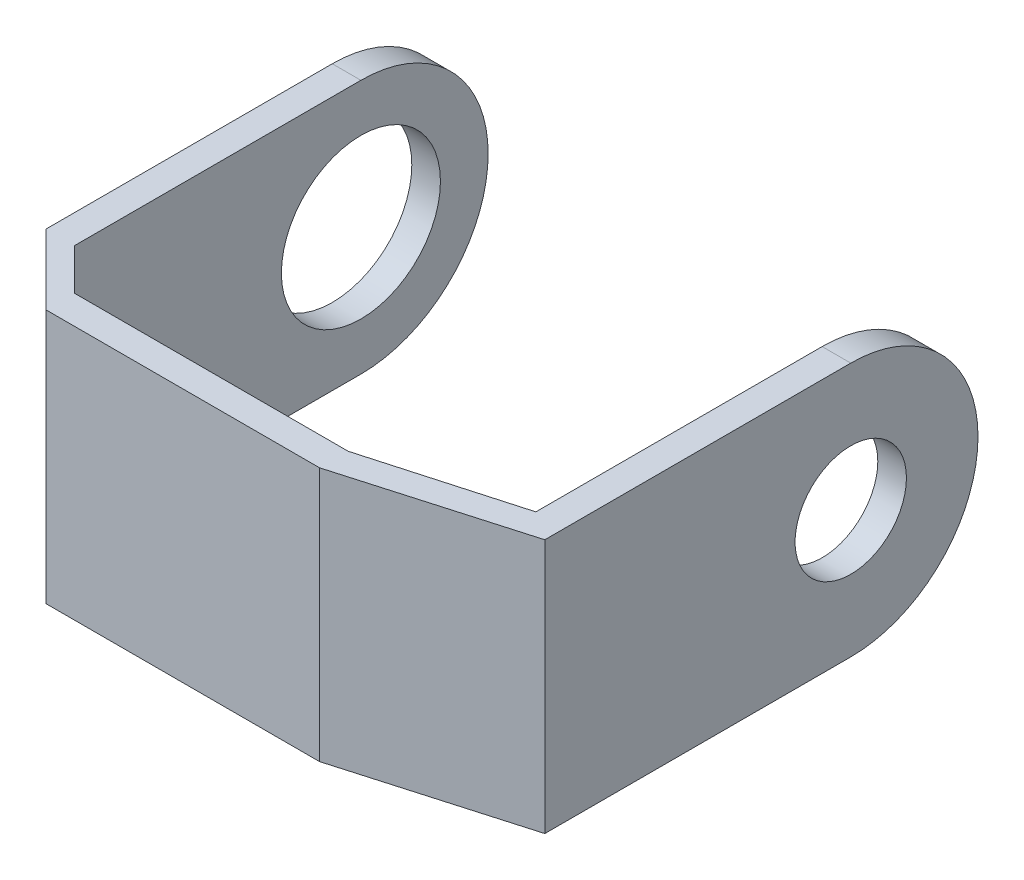
ISO-10303-21;
HEADER;
FILE_DESCRIPTION(('STEP AP214'),'2;1');
FILE_NAME('part.step','',(''),(''),'','','');
FILE_SCHEMA(('AUTOMOTIVE_DESIGN { 1 0 10303 214 1 1 1 1 }'));
ENDSEC;
DATA;
#1=APPLICATION_CONTEXT('core data for automotive mechanical design processes');
#2=APPLICATION_PROTOCOL_DEFINITION('international standard','automotive_design',2000,#1);
#3=PRODUCT_CONTEXT('',#1,'mechanical');
#4=PRODUCT('Part','Part','',(#3));
#5=PRODUCT_RELATED_PRODUCT_CATEGORY('part','',(#4));
#6=PRODUCT_DEFINITION_FORMATION('','',#4);
#7=PRODUCT_DEFINITION_CONTEXT('part definition',#1,'design');
#8=PRODUCT_DEFINITION('design','',#6,#7);
#9=PRODUCT_DEFINITION_SHAPE('','',#8);
#10=(LENGTH_UNIT() NAMED_UNIT(*) SI_UNIT(.MILLI.,.METRE.));
#11=(NAMED_UNIT(*) PLANE_ANGLE_UNIT() SI_UNIT($,.RADIAN.));
#12=(NAMED_UNIT(*) SI_UNIT($,.STERADIAN.) SOLID_ANGLE_UNIT());
#13=UNCERTAINTY_MEASURE_WITH_UNIT(LENGTH_MEASURE(1.E-05),#10,'distance_accuracy_value','');
#14=(GEOMETRIC_REPRESENTATION_CONTEXT(3) GLOBAL_UNCERTAINTY_ASSIGNED_CONTEXT((#13)) GLOBAL_UNIT_ASSIGNED_CONTEXT((#10,
#11,#12)) REPRESENTATION_CONTEXT('',''));
#15=CARTESIAN_POINT('',(0.,0.,0.));
#16=DIRECTION('',(0.,0.,1.));
#17=DIRECTION('',(1.,0.,0.));
#18=AXIS2_PLACEMENT_3D('',#15,#16,#17);
#19=CARTESIAN_POINT('',(-13.,16.,-28.6));
#20=DIRECTION('',(1.,0.,0.));
#21=DIRECTION('',(0.,0.,-1.));
#22=AXIS2_PLACEMENT_3D('',#19,#20,#21);
#23=PLANE('',#22);
#24=CARTESIAN_POINT('',(-13.,8.,-20.6));
#25=DIRECTION('',(-1.,0.,0.));
#26=DIRECTION('',(0.,0.,1.));
#27=AXIS2_PLACEMENT_3D('',#24,#25,#26);
#28=CIRCLE('',#27,5.);
#29=CARTESIAN_POINT('',(-13.,8.,-15.6));
#30=VERTEX_POINT('',#29);
#31=EDGE_CURVE('E246',#30,#30,#28,.T.);
#32=ORIENTED_EDGE('',*,*,#31,.F.);
#33=EDGE_LOOP('',(#32));
#34=FACE_BOUND('',#33,.T.);
#35=CARTESIAN_POINT('',(-13.,8.,-20.6));
#36=DIRECTION('',(1.,0.,0.));
#37=DIRECTION('',(0.,0.,-1.));
#38=AXIS2_PLACEMENT_3D('',#35,#36,#37);
#39=CIRCLE('',#38,8.);
#40=CARTESIAN_POINT('',(-13.,16.,-20.6));
#41=VERTEX_POINT('',#40);
#42=CARTESIAN_POINT('',(-13.,8.,-28.6));
#43=VERTEX_POINT('',#42);
#44=EDGE_CURVE('E60',#41,#43,#39,.F.);
#45=ORIENTED_EDGE('',*,*,#44,.T.);
#46=CARTESIAN_POINT('',(-13.,8.,-20.6));
#47=DIRECTION('',(1.,0.,0.));
#48=DIRECTION('',(0.,0.,-1.));
#49=AXIS2_PLACEMENT_3D('',#46,#47,#48);
#50=CIRCLE('',#49,8.);
#51=CARTESIAN_POINT('',(-13.,0.,-20.6));
#52=VERTEX_POINT('',#51);
#53=EDGE_CURVE('E237',#43,#52,#50,.F.);
#54=ORIENTED_EDGE('',*,*,#53,.T.);
#55=DIRECTION('',(0.,0.,1.));
#56=VECTOR('',#55,1.);
#57=CARTESIAN_POINT('',(-13.,0.,-28.6));
#58=LINE('',#57,#56);
#59=CARTESIAN_POINT('',(-13.,0.,-2.6));
#60=VERTEX_POINT('',#59);
#61=EDGE_CURVE('E152',#52,#60,#58,.T.);
#62=ORIENTED_EDGE('',*,*,#61,.T.);
#63=DIRECTION('',(0.,-1.,0.));
#64=VECTOR('',#63,1.);
#65=CARTESIAN_POINT('',(-13.,16.,-2.6));
#66=LINE('',#65,#64);
#67=CARTESIAN_POINT('',(-13.,16.,-2.6));
#68=VERTEX_POINT('',#67);
#69=EDGE_CURVE('E150',#68,#60,#66,.T.);
#70=ORIENTED_EDGE('',*,*,#69,.F.);
#71=DIRECTION('',(0.,0.,1.));
#72=VECTOR('',#71,1.);
#73=CARTESIAN_POINT('',(-13.,16.,-28.6));
#74=LINE('',#73,#72);
#75=EDGE_CURVE('E137',#41,#68,#74,.T.);
#76=ORIENTED_EDGE('',*,*,#75,.F.);
#77=EDGE_LOOP('',(#45,#54,#62,#70,#76));
#78=FACE_BOUND('',#77,.T.);
#79=ADVANCED_FACE('F37',(#34,#78),#23,.F.);
#80=CARTESIAN_POINT('',(-13.,16.,-2.6));
#81=DIRECTION('',(0.707106781186547,0.,-0.707106781186547));
#82=DIRECTION('',(-0.707106781186548,0.,-0.707106781186548));
#83=AXIS2_PLACEMENT_3D('',#80,#81,#82);
#84=PLANE('',#83);
#85=DIRECTION('',(0.707106781186548,0.,0.707106781186548));
#86=VECTOR('',#85,1.);
#87=CARTESIAN_POINT('',(-13.,0.,-2.6));
#88=LINE('',#87,#86);
#89=CARTESIAN_POINT('',(-8.6,0.,1.8));
#90=VERTEX_POINT('',#89);
#91=EDGE_CURVE('E182',#60,#90,#88,.T.);
#92=ORIENTED_EDGE('',*,*,#91,.T.);
#93=DIRECTION('',(0.,-1.,0.));
#94=VECTOR('',#93,1.);
#95=CARTESIAN_POINT('',(-8.6,16.,1.8));
#96=LINE('',#95,#94);
#97=CARTESIAN_POINT('',(-8.6,16.,1.8));
#98=VERTEX_POINT('',#97);
#99=EDGE_CURVE('E156',#98,#90,#96,.T.);
#100=ORIENTED_EDGE('',*,*,#99,.F.);
#101=DIRECTION('',(0.707106781186548,0.,0.707106781186548));
#102=VECTOR('',#101,1.);
#103=CARTESIAN_POINT('',(-13.,16.,-2.6));
#104=LINE('',#103,#102);
#105=EDGE_CURVE('E142',#68,#98,#104,.T.);
#106=ORIENTED_EDGE('',*,*,#105,.F.);
#107=ORIENTED_EDGE('',*,*,#69,.T.);
#108=EDGE_LOOP('',(#92,#100,#106,#107));
#109=FACE_BOUND('',#108,.T.);
#110=ADVANCED_FACE('F158',(#109),#84,.F.);
#111=CARTESIAN_POINT('',(-8.6,16.,1.8));
#112=DIRECTION('',(0.,0.,-1.));
#113=DIRECTION('',(-1.,0.,0.));
#114=AXIS2_PLACEMENT_3D('',#111,#112,#113);
#115=PLANE('',#114);
#116=DIRECTION('',(1.,0.,0.));
#117=VECTOR('',#116,1.);
#118=CARTESIAN_POINT('',(-8.6,0.,1.8));
#119=LINE('',#118,#117);
#120=CARTESIAN_POINT('',(8.6,0.,1.8));
#121=VERTEX_POINT('',#120);
#122=EDGE_CURVE('E185',#90,#121,#119,.T.);
#123=ORIENTED_EDGE('',*,*,#122,.T.);
#124=DIRECTION('',(0.,-1.,0.));
#125=VECTOR('',#124,1.);
#126=CARTESIAN_POINT('',(8.6,16.,1.8));
#127=LINE('',#126,#125);
#128=CARTESIAN_POINT('',(8.6,16.,1.8));
#129=VERTEX_POINT('',#128);
#130=EDGE_CURVE('E216',#129,#121,#127,.T.);
#131=ORIENTED_EDGE('',*,*,#130,.F.);
#132=DIRECTION('',(1.,0.,0.));
#133=VECTOR('',#132,1.);
#134=CARTESIAN_POINT('',(-8.6,16.,1.8));
#135=LINE('',#134,#133);
#136=EDGE_CURVE('E161',#98,#129,#135,.T.);
#137=ORIENTED_EDGE('',*,*,#136,.F.);
#138=ORIENTED_EDGE('',*,*,#99,.T.);
#139=EDGE_LOOP('',(#123,#131,#137,#138));
#140=FACE_BOUND('',#139,.T.);
#141=ADVANCED_FACE('F280',(#140),#115,.F.);
#142=CARTESIAN_POINT('',(8.6,16.,1.8));
#143=DIRECTION('',(-0.276381233053619,0.,-0.961048081011435));
#144=DIRECTION('',(-0.961048081011435,0.,0.276381233053619));
#145=AXIS2_PLACEMENT_3D('',#142,#143,#144);
#146=PLANE('',#145);
#147=DIRECTION('',(0.961048081011435,0.,-0.276381233053619));
#148=VECTOR('',#147,1.);
#149=CARTESIAN_POINT('',(8.6,0.,1.8));
#150=LINE('',#149,#148);
#151=CARTESIAN_POINT('',(19.6,0.,-1.36341463414631));
#152=VERTEX_POINT('',#151);
#153=EDGE_CURVE('E187',#121,#152,#150,.T.);
#154=ORIENTED_EDGE('',*,*,#153,.T.);
#155=DIRECTION('',(0.,-1.,0.));
#156=VECTOR('',#155,1.);
#157=CARTESIAN_POINT('',(19.6,16.,-1.36341463414631));
#158=LINE('',#157,#156);
#159=CARTESIAN_POINT('',(19.6,16.,-1.36341463414631));
#160=VERTEX_POINT('',#159);
#161=EDGE_CURVE('E213',#160,#152,#158,.T.);
#162=ORIENTED_EDGE('',*,*,#161,.F.);
#163=DIRECTION('',(0.961048081011435,0.,-0.276381233053619));
#164=VECTOR('',#163,1.);
#165=CARTESIAN_POINT('',(8.6,16.,1.8));
#166=LINE('',#165,#164);
#167=EDGE_CURVE('E163',#129,#160,#166,.T.);
#168=ORIENTED_EDGE('',*,*,#167,.F.);
#169=ORIENTED_EDGE('',*,*,#130,.T.);
#170=EDGE_LOOP('',(#154,#162,#168,#169));
#171=FACE_BOUND('',#170,.T.);
#172=ADVANCED_FACE('F265',(#171),#146,.F.);
#173=CARTESIAN_POINT('',(19.6,16.,-28.6));
#174=DIRECTION('',(-1.,0.,0.));
#175=DIRECTION('',(0.,0.,1.));
#176=AXIS2_PLACEMENT_3D('',#173,#174,#175);
#177=PLANE('',#176);
#178=CARTESIAN_POINT('',(19.6,8.,-20.6));
#179=DIRECTION('',(1.,0.,0.));
#180=DIRECTION('',(0.,0.,-1.));
#181=AXIS2_PLACEMENT_3D('',#178,#179,#180);
#182=CIRCLE('',#181,3.5);
#183=CARTESIAN_POINT('',(19.6,8.,-24.1));
#184=VERTEX_POINT('',#183);
#185=EDGE_CURVE('E253',#184,#184,#182,.T.);
#186=ORIENTED_EDGE('',*,*,#185,.F.);
#187=EDGE_LOOP('',(#186));
#188=FACE_BOUND('',#187,.T.);
#189=DIRECTION('',(0.,0.,-1.));
#190=VECTOR('',#189,1.);
#191=CARTESIAN_POINT('',(19.6,0.,-28.6));
#192=LINE('',#191,#190);
#193=CARTESIAN_POINT('',(19.6,0.,-20.6));
#194=VERTEX_POINT('',#193);
#195=EDGE_CURVE('E190',#152,#194,#192,.T.);
#196=ORIENTED_EDGE('',*,*,#195,.T.);
#197=CARTESIAN_POINT('',(19.6,8.,-20.6));
#198=DIRECTION('',(-1.,0.,0.));
#199=DIRECTION('',(0.,0.,1.));
#200=AXIS2_PLACEMENT_3D('',#197,#198,#199);
#201=CIRCLE('',#200,8.);
#202=CARTESIAN_POINT('',(19.6,8.,-28.6));
#203=VERTEX_POINT('',#202);
#204=EDGE_CURVE('E231',#194,#203,#201,.F.);
#205=ORIENTED_EDGE('',*,*,#204,.T.);
#206=CARTESIAN_POINT('',(19.6,8.,-20.6));
#207=DIRECTION('',(-1.,0.,0.));
#208=DIRECTION('',(0.,0.,1.));
#209=AXIS2_PLACEMENT_3D('',#206,#207,#208);
#210=CIRCLE('',#209,8.);
#211=CARTESIAN_POINT('',(19.6,16.,-20.6));
#212=VERTEX_POINT('',#211);
#213=EDGE_CURVE('E229',#203,#212,#210,.F.);
#214=ORIENTED_EDGE('',*,*,#213,.T.);
#215=DIRECTION('',(0.,0.,-1.));
#216=VECTOR('',#215,1.);
#217=CARTESIAN_POINT('',(19.6,16.,-2.6));
#218=LINE('',#217,#216);
#219=EDGE_CURVE('E168',#160,#212,#218,.T.);
#220=ORIENTED_EDGE('',*,*,#219,.F.);
#221=ORIENTED_EDGE('',*,*,#161,.T.);
#222=EDGE_LOOP('',(#196,#205,#214,#220,#221));
#223=FACE_BOUND('',#222,.T.);
#224=ADVANCED_FACE('F261',(#188,#223),#177,.F.);
#225=CARTESIAN_POINT('',(17.8,16.,-2.6));
#226=DIRECTION('',(1.,0.,0.));
#227=DIRECTION('',(0.,0.,-1.));
#228=AXIS2_PLACEMENT_3D('',#225,#226,#227);
#229=PLANE('',#228);
#230=CARTESIAN_POINT('',(17.8,8.,-20.6));
#231=DIRECTION('',(1.,0.,0.));
#232=DIRECTION('',(0.,0.,-1.));
#233=AXIS2_PLACEMENT_3D('',#230,#231,#232);
#234=CIRCLE('',#233,3.5);
#235=CARTESIAN_POINT('',(17.8,8.,-24.1));
#236=VERTEX_POINT('',#235);
#237=EDGE_CURVE('E41',#236,#236,#234,.T.);
#238=ORIENTED_EDGE('',*,*,#237,.T.);
#239=EDGE_LOOP('',(#238));
#240=FACE_BOUND('',#239,.T.);
#241=CARTESIAN_POINT('',(17.8,8.,-20.6));
#242=DIRECTION('',(1.,0.,0.));
#243=DIRECTION('',(0.,0.,-1.));
#244=AXIS2_PLACEMENT_3D('',#241,#242,#243);
#245=CIRCLE('',#244,8.);
#246=CARTESIAN_POINT('',(17.8,16.,-20.6));
#247=VERTEX_POINT('',#246);
#248=CARTESIAN_POINT('',(17.8,8.,-28.6));
#249=VERTEX_POINT('',#248);
#250=EDGE_CURVE('E155',#247,#249,#245,.F.);
#251=ORIENTED_EDGE('',*,*,#250,.T.);
#252=CARTESIAN_POINT('',(17.8,8.,-20.6));
#253=DIRECTION('',(1.,0.,0.));
#254=DIRECTION('',(0.,0.,-1.));
#255=AXIS2_PLACEMENT_3D('',#252,#253,#254);
#256=CIRCLE('',#255,8.);
#257=CARTESIAN_POINT('',(17.8,0.,-20.6));
#258=VERTEX_POINT('',#257);
#259=EDGE_CURVE('E221',#249,#258,#256,.F.);
#260=ORIENTED_EDGE('',*,*,#259,.T.);
#261=DIRECTION('',(0.,0.,1.));
#262=VECTOR('',#261,1.);
#263=CARTESIAN_POINT('',(17.8,0.,-2.6));
#264=LINE('',#263,#262);
#265=CARTESIAN_POINT('',(17.8,0.,-2.6));
#266=VERTEX_POINT('',#265);
#267=EDGE_CURVE('E193',#258,#266,#264,.T.);
#268=ORIENTED_EDGE('',*,*,#267,.T.);
#269=DIRECTION('',(0.,-1.,0.));
#270=VECTOR('',#269,1.);
#271=CARTESIAN_POINT('',(17.8,16.,-2.6));
#272=LINE('',#271,#270);
#273=CARTESIAN_POINT('',(17.8,16.,-2.6));
#274=VERTEX_POINT('',#273);
#275=EDGE_CURVE('E210',#274,#266,#272,.T.);
#276=ORIENTED_EDGE('',*,*,#275,.F.);
#277=DIRECTION('',(0.,0.,1.));
#278=VECTOR('',#277,1.);
#279=CARTESIAN_POINT('',(17.8,16.,-2.6));
#280=LINE('',#279,#278);
#281=EDGE_CURVE('E170',#247,#274,#280,.T.);
#282=ORIENTED_EDGE('',*,*,#281,.F.);
#283=EDGE_LOOP('',(#251,#260,#268,#276,#282));
#284=FACE_BOUND('',#283,.T.);
#285=ADVANCED_FACE('F264',(#240,#284),#229,.F.);
#286=CARTESIAN_POINT('',(8.6,16.,0.));
#287=DIRECTION('',(0.271957005225947,0.,0.962309403107199));
#288=DIRECTION('',(0.962309403107199,0.,-0.271957005225947));
#289=AXIS2_PLACEMENT_3D('',#286,#287,#288);
#290=PLANE('',#289);
#291=DIRECTION('',(-0.962309403107199,0.,0.271957005225947));
#292=VECTOR('',#291,1.);
#293=CARTESIAN_POINT('',(8.6,0.,0.));
#294=LINE('',#293,#292);
#295=CARTESIAN_POINT('',(8.6,0.,0.));
#296=VERTEX_POINT('',#295);
#297=EDGE_CURVE('E195',#266,#296,#294,.T.);
#298=ORIENTED_EDGE('',*,*,#297,.T.);
#299=DIRECTION('',(0.,-1.,0.));
#300=VECTOR('',#299,1.);
#301=CARTESIAN_POINT('',(8.6,16.,0.));
#302=LINE('',#301,#300);
#303=CARTESIAN_POINT('',(8.6,16.,0.));
#304=VERTEX_POINT('',#303);
#305=EDGE_CURVE('E207',#304,#296,#302,.T.);
#306=ORIENTED_EDGE('',*,*,#305,.F.);
#307=DIRECTION('',(-0.962309403107199,0.,0.271957005225947));
#308=VECTOR('',#307,1.);
#309=CARTESIAN_POINT('',(8.6,16.,0.));
#310=LINE('',#309,#308);
#311=EDGE_CURVE('E172',#274,#304,#310,.T.);
#312=ORIENTED_EDGE('',*,*,#311,.F.);
#313=ORIENTED_EDGE('',*,*,#275,.T.);
#314=EDGE_LOOP('',(#298,#306,#312,#313));
#315=FACE_BOUND('',#314,.T.);
#316=ADVANCED_FACE('F303',(#315),#290,.F.);
#317=CARTESIAN_POINT('',(-8.6,16.,0.));
#318=DIRECTION('',(0.,0.,1.));
#319=DIRECTION('',(1.,0.,0.));
#320=AXIS2_PLACEMENT_3D('',#317,#318,#319);
#321=PLANE('',#320);
#322=DIRECTION('',(-1.,0.,0.));
#323=VECTOR('',#322,1.);
#324=CARTESIAN_POINT('',(-8.6,0.,0.));
#325=LINE('',#324,#323);
#326=CARTESIAN_POINT('',(-8.6,0.,0.));
#327=VERTEX_POINT('',#326);
#328=EDGE_CURVE('E197',#296,#327,#325,.T.);
#329=ORIENTED_EDGE('',*,*,#328,.T.);
#330=DIRECTION('',(0.,-1.,0.));
#331=VECTOR('',#330,1.);
#332=CARTESIAN_POINT('',(-8.6,16.,0.));
#333=LINE('',#332,#331);
#334=CARTESIAN_POINT('',(-8.6,16.,0.));
#335=VERTEX_POINT('',#334);
#336=EDGE_CURVE('E204',#335,#327,#333,.T.);
#337=ORIENTED_EDGE('',*,*,#336,.F.);
#338=DIRECTION('',(-1.,0.,0.));
#339=VECTOR('',#338,1.);
#340=CARTESIAN_POINT('',(-8.6,16.,0.));
#341=LINE('',#340,#339);
#342=EDGE_CURVE('E174',#304,#335,#341,.T.);
#343=ORIENTED_EDGE('',*,*,#342,.F.);
#344=ORIENTED_EDGE('',*,*,#305,.T.);
#345=EDGE_LOOP('',(#329,#337,#343,#344));
#346=FACE_BOUND('',#345,.T.);
#347=ADVANCED_FACE('F299',(#346),#321,.F.);
#348=CARTESIAN_POINT('',(-8.6,16.,0.));
#349=DIRECTION('',(-0.707106781186547,0.,0.707106781186548));
#350=DIRECTION('',(0.707106781186548,0.,0.707106781186547));
#351=AXIS2_PLACEMENT_3D('',#348,#349,#350);
#352=PLANE('',#351);
#353=DIRECTION('',(-0.707106781186548,0.,-0.707106781186547));
#354=VECTOR('',#353,1.);
#355=CARTESIAN_POINT('',(-8.6,0.,0.));
#356=LINE('',#355,#354);
#357=CARTESIAN_POINT('',(-11.2,0.,-2.6));
#358=VERTEX_POINT('',#357);
#359=EDGE_CURVE('E199',#327,#358,#356,.T.);
#360=ORIENTED_EDGE('',*,*,#359,.T.);
#361=DIRECTION('',(0.,-1.,0.));
#362=VECTOR('',#361,1.);
#363=CARTESIAN_POINT('',(-11.2,16.,-2.6));
#364=LINE('',#363,#362);
#365=CARTESIAN_POINT('',(-11.2,16.,-2.6));
#366=VERTEX_POINT('',#365);
#367=EDGE_CURVE('E180',#366,#358,#364,.T.);
#368=ORIENTED_EDGE('',*,*,#367,.F.);
#369=DIRECTION('',(-0.707106781186548,0.,-0.707106781186547));
#370=VECTOR('',#369,1.);
#371=CARTESIAN_POINT('',(-8.6,16.,0.));
#372=LINE('',#371,#370);
#373=EDGE_CURVE('E176',#335,#366,#372,.T.);
#374=ORIENTED_EDGE('',*,*,#373,.F.);
#375=ORIENTED_EDGE('',*,*,#336,.T.);
#376=EDGE_LOOP('',(#360,#368,#374,#375));
#377=FACE_BOUND('',#376,.T.);
#378=ADVANCED_FACE('F294',(#377),#352,.F.);
#379=CARTESIAN_POINT('',(-11.2,16.,-2.6));
#380=DIRECTION('',(-1.,0.,0.));
#381=DIRECTION('',(0.,0.,1.));
#382=AXIS2_PLACEMENT_3D('',#379,#380,#381);
#383=PLANE('',#382);
#384=CARTESIAN_POINT('',(-11.2,8.,-20.6));
#385=DIRECTION('',(-1.,0.,0.));
#386=DIRECTION('',(0.,0.,1.));
#387=AXIS2_PLACEMENT_3D('',#384,#385,#386);
#388=CIRCLE('',#387,5.);
#389=CARTESIAN_POINT('',(-11.2,8.,-15.6));
#390=VERTEX_POINT('',#389);
#391=EDGE_CURVE('E244',#390,#390,#388,.T.);
#392=ORIENTED_EDGE('',*,*,#391,.T.);
#393=EDGE_LOOP('',(#392));
#394=FACE_BOUND('',#393,.T.);
#395=DIRECTION('',(0.,0.,-1.));
#396=VECTOR('',#395,1.);
#397=CARTESIAN_POINT('',(-11.2,0.,-2.6));
#398=LINE('',#397,#396);
#399=CARTESIAN_POINT('',(-11.2,0.,-20.6));
#400=VERTEX_POINT('',#399);
#401=EDGE_CURVE('E147',#358,#400,#398,.T.);
#402=ORIENTED_EDGE('',*,*,#401,.T.);
#403=CARTESIAN_POINT('',(-11.2,8.,-20.6));
#404=DIRECTION('',(-1.,0.,0.));
#405=DIRECTION('',(0.,0.,1.));
#406=AXIS2_PLACEMENT_3D('',#403,#404,#405);
#407=CIRCLE('',#406,8.);
#408=CARTESIAN_POINT('',(-11.2,8.,-28.6));
#409=VERTEX_POINT('',#408);
#410=EDGE_CURVE('E12',#400,#409,#407,.F.);
#411=ORIENTED_EDGE('',*,*,#410,.T.);
#412=CARTESIAN_POINT('',(-11.2,8.,-20.6));
#413=DIRECTION('',(-1.,0.,0.));
#414=DIRECTION('',(0.,0.,1.));
#415=AXIS2_PLACEMENT_3D('',#412,#413,#414);
#416=CIRCLE('',#415,8.);
#417=CARTESIAN_POINT('',(-11.2,16.,-20.6));
#418=VERTEX_POINT('',#417);
#419=EDGE_CURVE('E46',#409,#418,#416,.F.);
#420=ORIENTED_EDGE('',*,*,#419,.T.);
#421=DIRECTION('',(0.,0.,-1.));
#422=VECTOR('',#421,1.);
#423=CARTESIAN_POINT('',(-11.2,16.,-2.6));
#424=LINE('',#423,#422);
#425=EDGE_CURVE('E178',#366,#418,#424,.T.);
#426=ORIENTED_EDGE('',*,*,#425,.F.);
#427=ORIENTED_EDGE('',*,*,#367,.T.);
#428=EDGE_LOOP('',(#402,#411,#420,#426,#427));
#429=FACE_BOUND('',#428,.T.);
#430=ADVANCED_FACE('F288',(#394,#429),#383,.F.);
#431=CARTESIAN_POINT('',(0.,16.,0.));
#432=DIRECTION('',(0.,1.,0.));
#433=DIRECTION('',(0.,0.,1.));
#434=AXIS2_PLACEMENT_3D('',#431,#432,#433);
#435=PLANE('',#434);
#436=ORIENTED_EDGE('',*,*,#219,.T.);
#437=DIRECTION('',(-1.,0.,0.));
#438=VECTOR('',#437,1.);
#439=CARTESIAN_POINT('',(17.8,16.,-20.6));
#440=LINE('',#439,#438);
#441=EDGE_CURVE('E234',#212,#247,#440,.T.);
#442=ORIENTED_EDGE('',*,*,#441,.T.);
#443=ORIENTED_EDGE('',*,*,#281,.T.);
#444=ORIENTED_EDGE('',*,*,#311,.T.);
#445=ORIENTED_EDGE('',*,*,#342,.T.);
#446=ORIENTED_EDGE('',*,*,#373,.T.);
#447=ORIENTED_EDGE('',*,*,#425,.T.);
#448=DIRECTION('',(-1.,0.,0.));
#449=VECTOR('',#448,1.);
#450=CARTESIAN_POINT('',(-13.,16.,-20.6));
#451=LINE('',#450,#449);
#452=EDGE_CURVE('E146',#418,#41,#451,.T.);
#453=ORIENTED_EDGE('',*,*,#452,.T.);
#454=ORIENTED_EDGE('',*,*,#75,.T.);
#455=ORIENTED_EDGE('',*,*,#105,.T.);
#456=ORIENTED_EDGE('',*,*,#136,.T.);
#457=ORIENTED_EDGE('',*,*,#167,.T.);
#458=EDGE_LOOP('',(#436,#442,#443,#444,#445,#446,#447,#453,#454,#455,#456,#457));
#459=FACE_BOUND('',#458,.T.);
#460=ADVANCED_FACE('F140',(#459),#435,.T.);
#461=CARTESIAN_POINT('',(0.,0.,0.));
#462=DIRECTION('',(0.,1.,0.));
#463=DIRECTION('',(0.,0.,1.));
#464=AXIS2_PLACEMENT_3D('',#461,#462,#463);
#465=PLANE('',#464);
#466=ORIENTED_EDGE('',*,*,#267,.F.);
#467=DIRECTION('',(-1.,0.,0.));
#468=VECTOR('',#467,1.);
#469=CARTESIAN_POINT('',(0.,0.,-20.6));
#470=LINE('',#469,#468);
#471=EDGE_CURVE('E226',#258,#194,#470,.F.);
#472=ORIENTED_EDGE('',*,*,#471,.T.);
#473=ORIENTED_EDGE('',*,*,#195,.F.);
#474=ORIENTED_EDGE('',*,*,#153,.F.);
#475=ORIENTED_EDGE('',*,*,#122,.F.);
#476=ORIENTED_EDGE('',*,*,#91,.F.);
#477=ORIENTED_EDGE('',*,*,#61,.F.);
#478=DIRECTION('',(-1.,0.,0.));
#479=VECTOR('',#478,1.);
#480=CARTESIAN_POINT('',(0.,0.,-20.6));
#481=LINE('',#480,#479);
#482=EDGE_CURVE('E223',#52,#400,#481,.F.);
#483=ORIENTED_EDGE('',*,*,#482,.T.);
#484=ORIENTED_EDGE('',*,*,#401,.F.);
#485=ORIENTED_EDGE('',*,*,#359,.F.);
#486=ORIENTED_EDGE('',*,*,#328,.F.);
#487=ORIENTED_EDGE('',*,*,#297,.F.);
#488=EDGE_LOOP('',(#466,#472,#473,#474,#475,#476,#477,#483,#484,#485,#486,#487));
#489=FACE_BOUND('',#488,.T.);
#490=ADVANCED_FACE('F273',(#489),#465,.F.);
#491=CARTESIAN_POINT('',(0.,8.,-20.6));
#492=DIRECTION('',(1.,0.,0.));
#493=DIRECTION('',(0.,0.,-1.));
#494=AXIS2_PLACEMENT_3D('',#491,#492,#493);
#495=CYLINDRICAL_SURFACE('',#494,8.);
#496=ORIENTED_EDGE('',*,*,#441,.F.);
#497=ORIENTED_EDGE('',*,*,#213,.F.);
#498=DIRECTION('',(-1.,0.,0.));
#499=VECTOR('',#498,1.);
#500=CARTESIAN_POINT('',(19.6,8.,-28.6));
#501=LINE('',#500,#499);
#502=EDGE_CURVE('E183',#249,#203,#501,.F.);
#503=ORIENTED_EDGE('',*,*,#502,.F.);
#504=ORIENTED_EDGE('',*,*,#250,.F.);
#505=EDGE_LOOP('',(#496,#497,#503,#504));
#506=FACE_BOUND('',#505,.T.);
#507=ADVANCED_FACE('F314',(#506),#495,.T.);
#508=CARTESIAN_POINT('',(17.8,8.,-20.6));
#509=DIRECTION('',(-1.,0.,0.));
#510=DIRECTION('',(0.,0.,1.));
#511=AXIS2_PLACEMENT_3D('',#508,#509,#510);
#512=CYLINDRICAL_SURFACE('',#511,8.);
#513=ORIENTED_EDGE('',*,*,#204,.F.);
#514=ORIENTED_EDGE('',*,*,#471,.F.);
#515=ORIENTED_EDGE('',*,*,#259,.F.);
#516=ORIENTED_EDGE('',*,*,#502,.T.);
#517=EDGE_LOOP('',(#513,#514,#515,#516));
#518=FACE_BOUND('',#517,.T.);
#519=ADVANCED_FACE('F310',(#518),#512,.T.);
#520=CARTESIAN_POINT('',(0.,8.,-20.6));
#521=DIRECTION('',(1.,0.,0.));
#522=DIRECTION('',(0.,0.,-1.));
#523=AXIS2_PLACEMENT_3D('',#520,#521,#522);
#524=CYLINDRICAL_SURFACE('',#523,8.);
#525=ORIENTED_EDGE('',*,*,#452,.F.);
#526=ORIENTED_EDGE('',*,*,#419,.F.);
#527=DIRECTION('',(-1.,0.,0.));
#528=VECTOR('',#527,1.);
#529=CARTESIAN_POINT('',(-11.2,8.,-28.6));
#530=LINE('',#529,#528);
#531=EDGE_CURVE('E242',#43,#409,#530,.F.);
#532=ORIENTED_EDGE('',*,*,#531,.F.);
#533=ORIENTED_EDGE('',*,*,#44,.F.);
#534=EDGE_LOOP('',(#525,#526,#532,#533));
#535=FACE_BOUND('',#534,.T.);
#536=ADVANCED_FACE('F39',(#535),#524,.T.);
#537=CARTESIAN_POINT('',(-11.2,8.,-20.6));
#538=DIRECTION('',(-1.,0.,0.));
#539=DIRECTION('',(0.,0.,1.));
#540=AXIS2_PLACEMENT_3D('',#537,#538,#539);
#541=CYLINDRICAL_SURFACE('',#540,8.);
#542=ORIENTED_EDGE('',*,*,#410,.F.);
#543=ORIENTED_EDGE('',*,*,#482,.F.);
#544=ORIENTED_EDGE('',*,*,#53,.F.);
#545=ORIENTED_EDGE('',*,*,#531,.T.);
#546=EDGE_LOOP('',(#542,#543,#544,#545));
#547=FACE_BOUND('',#546,.T.);
#548=ADVANCED_FACE('F285',(#547),#541,.T.);
#549=CARTESIAN_POINT('',(-11.,8.,-20.6));
#550=DIRECTION('',(-1.,0.,0.));
#551=DIRECTION('',(0.,0.,1.));
#552=AXIS2_PLACEMENT_3D('',#549,#550,#551);
#553=CYLINDRICAL_SURFACE('',#552,5.);
#554=ORIENTED_EDGE('',*,*,#31,.T.);
#555=EDGE_LOOP('',(#554));
#556=FACE_BOUND('',#555,.T.);
#557=ORIENTED_EDGE('',*,*,#391,.F.);
#558=EDGE_LOOP('',(#557));
#559=FACE_BOUND('',#558,.T.);
#560=ADVANCED_FACE('F348',(#556,#559),#553,.F.);
#561=CARTESIAN_POINT('',(17.6,8.,-20.6));
#562=DIRECTION('',(1.,0.,0.));
#563=DIRECTION('',(0.,0.,-1.));
#564=AXIS2_PLACEMENT_3D('',#561,#562,#563);
#565=CYLINDRICAL_SURFACE('',#564,3.5);
#566=ORIENTED_EDGE('',*,*,#185,.T.);
#567=EDGE_LOOP('',(#566));
#568=FACE_BOUND('',#567,.T.);
#569=ORIENTED_EDGE('',*,*,#237,.F.);
#570=EDGE_LOOP('',(#569));
#571=FACE_BOUND('',#570,.T.);
#572=ADVANCED_FACE('F258',(#568,#571),#565,.F.);
#573=CLOSED_SHELL('',(#79,#110,#141,#172,#224,#285,#316,#347,#378,#430,#460,#490,#507,#519,#536,
#548,#560,#572));
#574=MANIFOLD_SOLID_BREP('B2',#573);
#575=ADVANCED_BREP_SHAPE_REPRESENTATION('',(#18,#574),#14);
#576=SHAPE_DEFINITION_REPRESENTATION(#9,#575);
ENDSEC;
END-ISO-10303-21;
